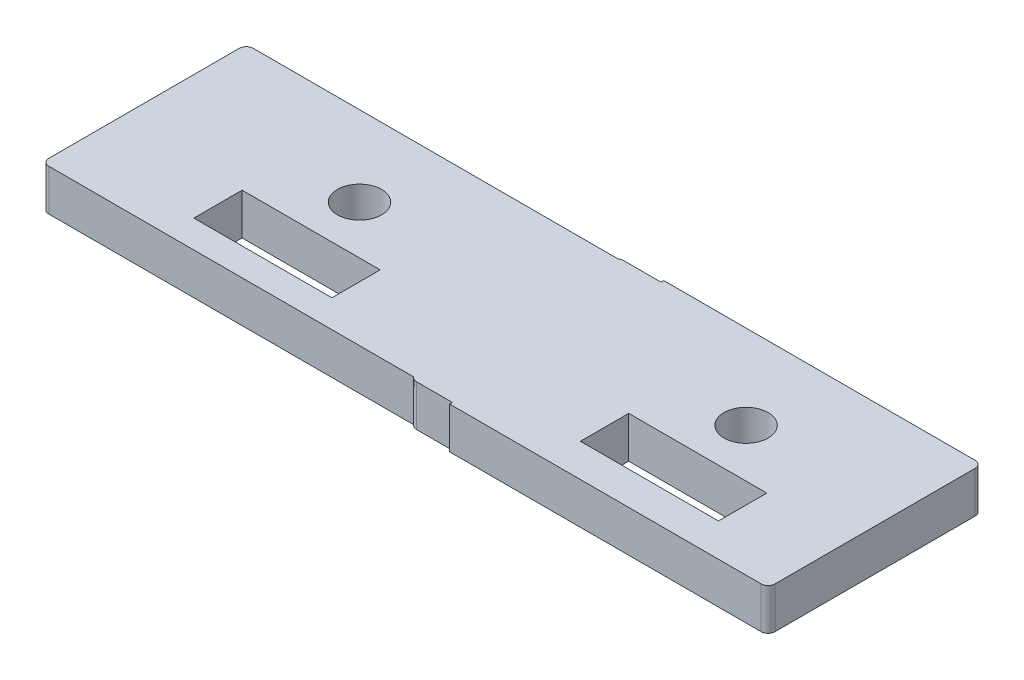
ISO-10303-21;
HEADER;
FILE_DESCRIPTION(('STEP AP214'),'2;1');
FILE_NAME('part.step','',(''),(''),'','','');
FILE_SCHEMA(('AUTOMOTIVE_DESIGN { 1 0 10303 214 1 1 1 1 }'));
ENDSEC;
DATA;
#1=APPLICATION_CONTEXT('core data for automotive mechanical design processes');
#2=APPLICATION_PROTOCOL_DEFINITION('international standard','automotive_design',2000,#1);
#3=PRODUCT_CONTEXT('',#1,'mechanical');
#4=PRODUCT('Part','Part','',(#3));
#5=PRODUCT_RELATED_PRODUCT_CATEGORY('part','',(#4));
#6=PRODUCT_DEFINITION_FORMATION('','',#4);
#7=PRODUCT_DEFINITION_CONTEXT('part definition',#1,'design');
#8=PRODUCT_DEFINITION('design','',#6,#7);
#9=PRODUCT_DEFINITION_SHAPE('','',#8);
#10=(LENGTH_UNIT() NAMED_UNIT(*) SI_UNIT(.MILLI.,.METRE.));
#11=(NAMED_UNIT(*) PLANE_ANGLE_UNIT() SI_UNIT($,.RADIAN.));
#12=(NAMED_UNIT(*) SI_UNIT($,.STERADIAN.) SOLID_ANGLE_UNIT());
#13=UNCERTAINTY_MEASURE_WITH_UNIT(LENGTH_MEASURE(1.E-05),#10,'distance_accuracy_value','');
#14=(GEOMETRIC_REPRESENTATION_CONTEXT(3) GLOBAL_UNCERTAINTY_ASSIGNED_CONTEXT((#13)) GLOBAL_UNIT_ASSIGNED_CONTEXT((#10,
#11,#12)) REPRESENTATION_CONTEXT('',''));
#15=CARTESIAN_POINT('',(0.,0.,0.));
#16=DIRECTION('',(0.,0.,1.));
#17=DIRECTION('',(1.,0.,0.));
#18=AXIS2_PLACEMENT_3D('',#15,#16,#17);
#19=CARTESIAN_POINT('',(0.,10.,0.100000000000835));
#20=DIRECTION('',(0.,0.,1.));
#21=DIRECTION('',(1.,0.,0.));
#22=AXIS2_PLACEMENT_3D('',#19,#20,#21);
#23=PLANE('',#22);
#24=DIRECTION('',(-1.,0.,0.));
#25=VECTOR('',#24,1.);
#26=CARTESIAN_POINT('',(0.,0.,0.100000000000835));
#27=LINE('',#26,#25);
#28=CARTESIAN_POINT('',(-45.0678313095659,0.,0.10000000000083));
#29=VERTEX_POINT('',#28);
#30=CARTESIAN_POINT('',(-47.7678313095659,0.,0.10000000000083));
#31=VERTEX_POINT('',#30);
#32=EDGE_CURVE('E279',#29,#31,#27,.T.);
#33=ORIENTED_EDGE('',*,*,#32,.T.);
#34=DIRECTION('',(0.,-1.,0.));
#35=VECTOR('',#34,1.);
#36=CARTESIAN_POINT('',(-47.7678313095659,10.,0.10000000000083));
#37=LINE('',#36,#35);
#38=CARTESIAN_POINT('',(-47.7678313095659,3.,0.10000000000083));
#39=VERTEX_POINT('',#38);
#40=EDGE_CURVE('E432',#31,#39,#37,.F.);
#41=ORIENTED_EDGE('',*,*,#40,.T.);
#42=DIRECTION('',(-1.,0.,0.));
#43=VECTOR('',#42,1.);
#44=CARTESIAN_POINT('',(0.,3.,0.100000000000835));
#45=LINE('',#44,#43);
#46=CARTESIAN_POINT('',(-45.0678313095659,3.,0.10000000000083));
#47=VERTEX_POINT('',#46);
#48=EDGE_CURVE('E294',#47,#39,#45,.T.);
#49=ORIENTED_EDGE('',*,*,#48,.F.);
#50=DIRECTION('',(0.,1.,0.));
#51=VECTOR('',#50,1.);
#52=CARTESIAN_POINT('',(-45.0678313095659,0.,0.10000000000083));
#53=LINE('',#52,#51);
#54=EDGE_CURVE('E235',#29,#47,#53,.T.);
#55=ORIENTED_EDGE('',*,*,#54,.F.);
#56=EDGE_LOOP('',(#33,#41,#49,#55));
#57=FACE_BOUND('',#56,.T.);
#58=ADVANCED_FACE('F42',(#57),#23,.F.);
#59=CARTESIAN_POINT('',(-75.,3.,15.));
#60=DIRECTION('',(0.,0.,-1.));
#61=DIRECTION('',(-1.,0.,0.));
#62=AXIS2_PLACEMENT_3D('',#59,#60,#61);
#63=PLANE('',#62);
#64=DIRECTION('',(1.,0.,0.));
#65=VECTOR('',#64,1.);
#66=CARTESIAN_POINT('',(-75.,3.,15.));
#67=LINE('',#66,#65);
#68=CARTESIAN_POINT('',(-74.5,3.,15.));
#69=VERTEX_POINT('',#68);
#70=CARTESIAN_POINT('',(-48.0678313095659,3.,15.));
#71=VERTEX_POINT('',#70);
#72=EDGE_CURVE('E405',#69,#71,#67,.T.);
#73=ORIENTED_EDGE('',*,*,#72,.F.);
#74=DIRECTION('',(0.,-1.,0.));
#75=VECTOR('',#74,1.);
#76=CARTESIAN_POINT('',(-74.5,3.,15.));
#77=LINE('',#76,#75);
#78=CARTESIAN_POINT('',(-74.5,0.,15.));
#79=VERTEX_POINT('',#78);
#80=EDGE_CURVE('E11',#69,#79,#77,.T.);
#81=ORIENTED_EDGE('',*,*,#80,.T.);
#82=DIRECTION('',(1.,0.,0.));
#83=VECTOR('',#82,1.);
#84=CARTESIAN_POINT('',(-75.,0.,15.));
#85=LINE('',#84,#83);
#86=CARTESIAN_POINT('',(-48.0678313095659,0.,15.));
#87=VERTEX_POINT('',#86);
#88=EDGE_CURVE('E406',#79,#87,#85,.T.);
#89=ORIENTED_EDGE('',*,*,#88,.T.);
#90=DIRECTION('',(0.,-1.,0.));
#91=VECTOR('',#90,1.);
#92=CARTESIAN_POINT('',(-48.0678313095659,3.,15.));
#93=LINE('',#92,#91);
#94=EDGE_CURVE('E262',#71,#87,#93,.T.);
#95=ORIENTED_EDGE('',*,*,#94,.F.);
#96=EDGE_LOOP('',(#73,#81,#89,#95));
#97=FACE_BOUND('',#96,.T.);
#98=ADVANCED_FACE('F495',(#97),#63,.F.);
#99=CARTESIAN_POINT('',(-75.,3.,15.));
#100=DIRECTION('',(1.,0.,0.));
#101=DIRECTION('',(0.,0.,-1.));
#102=AXIS2_PLACEMENT_3D('',#99,#100,#101);
#103=PLANE('',#102);
#104=DIRECTION('',(0.,0.,1.));
#105=VECTOR('',#104,1.);
#106=CARTESIAN_POINT('',(-75.,3.,15.));
#107=LINE('',#106,#105);
#108=CARTESIAN_POINT('',(-75.,3.,0.700000000000827));
#109=VERTEX_POINT('',#108);
#110=CARTESIAN_POINT('',(-75.,3.,14.5));
#111=VERTEX_POINT('',#110);
#112=EDGE_CURVE('E402',#109,#111,#107,.T.);
#113=ORIENTED_EDGE('',*,*,#112,.F.);
#114=DIRECTION('',(0.,-1.,0.));
#115=VECTOR('',#114,1.);
#116=CARTESIAN_POINT('',(-75.,3.,0.700000000000827));
#117=LINE('',#116,#115);
#118=CARTESIAN_POINT('',(-75.,0.,0.700000000000827));
#119=VERTEX_POINT('',#118);
#120=EDGE_CURVE('E470',#109,#119,#117,.T.);
#121=ORIENTED_EDGE('',*,*,#120,.T.);
#122=DIRECTION('',(0.,0.,1.));
#123=VECTOR('',#122,1.);
#124=CARTESIAN_POINT('',(-75.,0.,15.));
#125=LINE('',#124,#123);
#126=CARTESIAN_POINT('',(-75.,0.,14.5));
#127=VERTEX_POINT('',#126);
#128=EDGE_CURVE('E392',#119,#127,#125,.T.);
#129=ORIENTED_EDGE('',*,*,#128,.T.);
#130=DIRECTION('',(0.,-1.,0.));
#131=VECTOR('',#130,1.);
#132=CARTESIAN_POINT('',(-75.,3.,14.5));
#133=LINE('',#132,#131);
#134=EDGE_CURVE('E58',#127,#111,#133,.F.);
#135=ORIENTED_EDGE('',*,*,#134,.T.);
#136=EDGE_LOOP('',(#113,#121,#129,#135));
#137=FACE_BOUND('',#136,.T.);
#138=ADVANCED_FACE('F485',(#137),#103,.F.);
#139=CARTESIAN_POINT('',(0.,3.,0.));
#140=DIRECTION('',(0.,-1.,0.));
#141=DIRECTION('',(0.,0.,-1.));
#142=AXIS2_PLACEMENT_3D('',#139,#140,#141);
#143=PLANE('',#142);
#144=DIRECTION('',(1.,0.,0.));
#145=VECTOR('',#144,1.);
#146=CARTESIAN_POINT('',(-66.,3.,13.0000000000008));
#147=LINE('',#146,#145);
#148=CARTESIAN_POINT('',(-66.,3.,13.0000000000008));
#149=VERTEX_POINT('',#148);
#150=CARTESIAN_POINT('',(-56.,3.,13.0000000000008));
#151=VERTEX_POINT('',#150);
#152=EDGE_CURVE('E378',#149,#151,#147,.T.);
#153=ORIENTED_EDGE('',*,*,#152,.F.);
#154=DIRECTION('',(0.,0.,1.));
#155=VECTOR('',#154,1.);
#156=CARTESIAN_POINT('',(-66.,3.,9.50000000000086));
#157=LINE('',#156,#155);
#158=CARTESIAN_POINT('',(-66.,3.,9.50000000000086));
#159=VERTEX_POINT('',#158);
#160=EDGE_CURVE('E302',#159,#149,#157,.T.);
#161=ORIENTED_EDGE('',*,*,#160,.F.);
#162=DIRECTION('',(-1.,0.,0.));
#163=VECTOR('',#162,1.);
#164=CARTESIAN_POINT('',(-66.,3.,9.50000000000086));
#165=LINE('',#164,#163);
#166=CARTESIAN_POINT('',(-56.,3.,9.50000000000086));
#167=VERTEX_POINT('',#166);
#168=EDGE_CURVE('E363',#167,#159,#165,.T.);
#169=ORIENTED_EDGE('',*,*,#168,.F.);
#170=DIRECTION('',(0.,0.,-1.));
#171=VECTOR('',#170,1.);
#172=CARTESIAN_POINT('',(-56.,3.,9.50000000000086));
#173=LINE('',#172,#171);
#174=EDGE_CURVE('E382',#151,#167,#173,.T.);
#175=ORIENTED_EDGE('',*,*,#174,.F.);
#176=EDGE_LOOP('',(#153,#161,#169,#175));
#177=FACE_BOUND('',#176,.T.);
#178=CARTESIAN_POINT('',(-33.,3.,6.00000000000105));
#179=DIRECTION('',(0.,1.,0.));
#180=DIRECTION('',(0.,0.,-1.));
#181=AXIS2_PLACEMENT_3D('',#178,#179,#180);
#182=CIRCLE('',#181,1.60000000000001);
#183=CARTESIAN_POINT('',(-33.,3.,4.40000000000104));
#184=VERTEX_POINT('',#183);
#185=EDGE_CURVE('E303',#184,#184,#182,.T.);
#186=ORIENTED_EDGE('',*,*,#185,.F.);
#187=EDGE_LOOP('',(#186));
#188=FACE_BOUND('',#187,.T.);
#189=DIRECTION('',(1.,0.,0.));
#190=VECTOR('',#189,1.);
#191=CARTESIAN_POINT('',(-38.,3.,13.0000000000011));
#192=LINE('',#191,#190);
#193=CARTESIAN_POINT('',(-38.,3.,13.0000000000011));
#194=VERTEX_POINT('',#193);
#195=CARTESIAN_POINT('',(-28.,3.,13.0000000000011));
#196=VERTEX_POINT('',#195);
#197=EDGE_CURVE('E329',#194,#196,#192,.T.);
#198=ORIENTED_EDGE('',*,*,#197,.F.);
#199=DIRECTION('',(0.,0.,1.));
#200=VECTOR('',#199,1.);
#201=CARTESIAN_POINT('',(-38.,3.,9.50000000000106));
#202=LINE('',#201,#200);
#203=CARTESIAN_POINT('',(-38.,3.,9.50000000000106));
#204=VERTEX_POINT('',#203);
#205=EDGE_CURVE('E326',#204,#194,#202,.T.);
#206=ORIENTED_EDGE('',*,*,#205,.F.);
#207=DIRECTION('',(-1.,0.,0.));
#208=VECTOR('',#207,1.);
#209=CARTESIAN_POINT('',(-38.,3.,9.50000000000106));
#210=LINE('',#209,#208);
#211=CARTESIAN_POINT('',(-28.,3.,9.50000000000106));
#212=VERTEX_POINT('',#211);
#213=EDGE_CURVE('E313',#212,#204,#210,.T.);
#214=ORIENTED_EDGE('',*,*,#213,.F.);
#215=DIRECTION('',(0.,0.,-1.));
#216=VECTOR('',#215,1.);
#217=CARTESIAN_POINT('',(-28.,3.,9.50000000000106));
#218=LINE('',#217,#216);
#219=EDGE_CURVE('E334',#196,#212,#218,.T.);
#220=ORIENTED_EDGE('',*,*,#219,.F.);
#221=EDGE_LOOP('',(#198,#206,#214,#220));
#222=FACE_BOUND('',#221,.T.);
#223=CARTESIAN_POINT('',(-61.,3.,6.00000000000085));
#224=DIRECTION('',(0.,1.,0.));
#225=DIRECTION('',(0.,0.,-1.));
#226=AXIS2_PLACEMENT_3D('',#223,#224,#225);
#227=CIRCLE('',#226,1.60000000000001);
#228=CARTESIAN_POINT('',(-61.,3.,4.40000000000085));
#229=VERTEX_POINT('',#228);
#230=EDGE_CURVE('E297',#229,#229,#227,.T.);
#231=ORIENTED_EDGE('',*,*,#230,.F.);
#232=EDGE_LOOP('',(#231));
#233=FACE_BOUND('',#232,.T.);
#234=ORIENTED_EDGE('',*,*,#48,.T.);
#235=CARTESIAN_POINT('',(-47.7678313095659,3.,0.60000000000083));
#236=DIRECTION('',(0.,-1.,0.));
#237=DIRECTION('',(0.,0.,-1.));
#238=AXIS2_PLACEMENT_3D('',#235,#236,#237);
#239=CIRCLE('',#238,0.5);
#240=CARTESIAN_POINT('',(-48.0678313095659,3.,0.200000000000829));
#241=VERTEX_POINT('',#240);
#242=EDGE_CURVE('E449',#39,#241,#239,.F.);
#243=ORIENTED_EDGE('',*,*,#242,.T.);
#244=DIRECTION('',(-1.,0.,0.));
#245=VECTOR('',#244,1.);
#246=CARTESIAN_POINT('',(0.,3.,0.200000000000835));
#247=LINE('',#246,#245);
#248=CARTESIAN_POINT('',(-74.5,3.,0.200000000000826));
#249=VERTEX_POINT('',#248);
#250=EDGE_CURVE('E287',#241,#249,#247,.T.);
#251=ORIENTED_EDGE('',*,*,#250,.T.);
#252=CARTESIAN_POINT('',(-74.5,3.,0.700000000000827));
#253=DIRECTION('',(0.,-1.,0.));
#254=DIRECTION('',(0.,0.,-1.));
#255=AXIS2_PLACEMENT_3D('',#252,#253,#254);
#256=CIRCLE('',#255,0.5);
#257=EDGE_CURVE('E65',#249,#109,#256,.F.);
#258=ORIENTED_EDGE('',*,*,#257,.T.);
#259=ORIENTED_EDGE('',*,*,#112,.T.);
#260=CARTESIAN_POINT('',(-74.5,3.,14.5));
#261=DIRECTION('',(0.,-1.,0.));
#262=DIRECTION('',(0.,0.,-1.));
#263=AXIS2_PLACEMENT_3D('',#260,#261,#262);
#264=CIRCLE('',#263,0.5);
#265=EDGE_CURVE('E435',#111,#69,#264,.F.);
#266=ORIENTED_EDGE('',*,*,#265,.T.);
#267=ORIENTED_EDGE('',*,*,#72,.T.);
#268=CARTESIAN_POINT('',(-47.6678313095659,3.,14.7));
#269=DIRECTION('',(0.,-1.,0.));
#270=DIRECTION('',(0.,0.,-1.));
#271=AXIS2_PLACEMENT_3D('',#268,#269,#270);
#272=CIRCLE('',#271,0.5);
#273=CARTESIAN_POINT('',(-47.6678313095659,3.,15.2));
#274=VERTEX_POINT('',#273);
#275=EDGE_CURVE('E446',#71,#274,#272,.F.);
#276=ORIENTED_EDGE('',*,*,#275,.T.);
#277=DIRECTION('',(-1.,0.,0.));
#278=VECTOR('',#277,1.);
#279=CARTESIAN_POINT('',(-48.0678313095659,3.,15.2));
#280=LINE('',#279,#278);
#281=CARTESIAN_POINT('',(-45.0678313095659,3.,15.2));
#282=VERTEX_POINT('',#281);
#283=EDGE_CURVE('E233',#282,#274,#280,.T.);
#284=ORIENTED_EDGE('',*,*,#283,.F.);
#285=DIRECTION('',(0.,0.,-1.));
#286=VECTOR('',#285,1.);
#287=CARTESIAN_POINT('',(-45.0678313095659,3.,15.4));
#288=LINE('',#287,#286);
#289=CARTESIAN_POINT('',(-45.0678313095659,3.,15.4));
#290=VERTEX_POINT('',#289);
#291=EDGE_CURVE('E222',#290,#282,#288,.T.);
#292=ORIENTED_EDGE('',*,*,#291,.F.);
#293=DIRECTION('',(-1.,0.,0.));
#294=VECTOR('',#293,1.);
#295=CARTESIAN_POINT('',(0.,3.,15.4));
#296=LINE('',#295,#294);
#297=CARTESIAN_POINT('',(-22.5080123362056,3.,15.4));
#298=VERTEX_POINT('',#297);
#299=EDGE_CURVE('E206',#298,#290,#296,.T.);
#300=ORIENTED_EDGE('',*,*,#299,.F.);
#301=CARTESIAN_POINT('',(-22.5080123362056,3.,14.9));
#302=DIRECTION('',(0.,-1.,0.));
#303=DIRECTION('',(0.,0.,-1.));
#304=AXIS2_PLACEMENT_3D('',#301,#302,#303);
#305=CIRCLE('',#304,0.5);
#306=CARTESIAN_POINT('',(-22.0080123362056,3.,14.9));
#307=VERTEX_POINT('',#306);
#308=EDGE_CURVE('E443',#298,#307,#305,.F.);
#309=ORIENTED_EDGE('',*,*,#308,.T.);
#310=DIRECTION('',(0.,0.,-1.));
#311=VECTOR('',#310,1.);
#312=CARTESIAN_POINT('',(-22.0080123362056,3.,0.));
#313=LINE('',#312,#311);
#314=CARTESIAN_POINT('',(-22.0080123362056,3.,0.400000000000833));
#315=VERTEX_POINT('',#314);
#316=EDGE_CURVE('E290',#307,#315,#313,.T.);
#317=ORIENTED_EDGE('',*,*,#316,.T.);
#318=CARTESIAN_POINT('',(-22.5080123362056,3.,0.400000000000833));
#319=DIRECTION('',(0.,-1.,0.));
#320=DIRECTION('',(0.,0.,-1.));
#321=AXIS2_PLACEMENT_3D('',#318,#319,#320);
#322=CIRCLE('',#321,0.5);
#323=CARTESIAN_POINT('',(-22.5080123362056,3.,-0.0999999999991671));
#324=VERTEX_POINT('',#323);
#325=EDGE_CURVE('E440',#315,#324,#322,.F.);
#326=ORIENTED_EDGE('',*,*,#325,.T.);
#327=DIRECTION('',(1.,0.,0.));
#328=VECTOR('',#327,1.);
#329=CARTESIAN_POINT('',(0.,3.,-0.0999999999991645));
#330=LINE('',#329,#328);
#331=CARTESIAN_POINT('',(-45.0678313095659,3.,-0.0999999999991698));
#332=VERTEX_POINT('',#331);
#333=EDGE_CURVE('E250',#332,#324,#330,.T.);
#334=ORIENTED_EDGE('',*,*,#333,.F.);
#335=DIRECTION('',(0.,0.,1.));
#336=VECTOR('',#335,1.);
#337=CARTESIAN_POINT('',(-45.0678313095659,3.,-0.0999999999991698));
#338=LINE('',#337,#336);
#339=EDGE_CURVE('E253',#332,#47,#338,.T.);
#340=ORIENTED_EDGE('',*,*,#339,.T.);
#341=EDGE_LOOP('',(#234,#243,#251,#258,#259,#266,#267,#276,#284,#292,#300,#309,#317,#326,#334,#340));
#342=FACE_BOUND('',#341,.T.);
#343=ADVANCED_FACE('F231',(#177,#188,#222,#233,#342),#143,.F.);
#344=CARTESIAN_POINT('',(0.,0.,0.));
#345=DIRECTION('',(0.,-1.,0.));
#346=DIRECTION('',(0.,0.,-1.));
#347=AXIS2_PLACEMENT_3D('',#344,#345,#346);
#348=PLANE('',#347);
#349=DIRECTION('',(-1.,0.,0.));
#350=VECTOR('',#349,1.);
#351=CARTESIAN_POINT('',(0.,0.,0.200000000000835));
#352=LINE('',#351,#350);
#353=CARTESIAN_POINT('',(-48.0678313095659,0.,0.200000000000829));
#354=VERTEX_POINT('',#353);
#355=CARTESIAN_POINT('',(-74.5,0.,0.200000000000826));
#356=VERTEX_POINT('',#355);
#357=EDGE_CURVE('E268',#354,#356,#352,.T.);
#358=ORIENTED_EDGE('',*,*,#357,.F.);
#359=CARTESIAN_POINT('',(-47.7678313095659,0.,0.60000000000083));
#360=DIRECTION('',(0.,-1.,0.));
#361=DIRECTION('',(0.,0.,-1.));
#362=AXIS2_PLACEMENT_3D('',#359,#360,#361);
#363=CIRCLE('',#362,0.5);
#364=EDGE_CURVE('E429',#354,#31,#363,.T.);
#365=ORIENTED_EDGE('',*,*,#364,.T.);
#366=ORIENTED_EDGE('',*,*,#32,.F.);
#367=DIRECTION('',(0.,0.,1.));
#368=VECTOR('',#367,1.);
#369=CARTESIAN_POINT('',(-45.0678313095659,0.,-0.0999999999991698));
#370=LINE('',#369,#368);
#371=CARTESIAN_POINT('',(-45.0678313095659,0.,-0.0999999999991698));
#372=VERTEX_POINT('',#371);
#373=EDGE_CURVE('E258',#372,#29,#370,.T.);
#374=ORIENTED_EDGE('',*,*,#373,.F.);
#375=DIRECTION('',(-1.,0.,0.));
#376=VECTOR('',#375,1.);
#377=CARTESIAN_POINT('',(0.,0.,-0.0999999999991645));
#378=LINE('',#377,#376);
#379=CARTESIAN_POINT('',(-22.5080123362056,0.,-0.0999999999991671));
#380=VERTEX_POINT('',#379);
#381=EDGE_CURVE('E240',#380,#372,#378,.T.);
#382=ORIENTED_EDGE('',*,*,#381,.F.);
#383=CARTESIAN_POINT('',(-22.5080123362056,0.,0.400000000000833));
#384=DIRECTION('',(0.,-1.,0.));
#385=DIRECTION('',(0.,0.,-1.));
#386=AXIS2_PLACEMENT_3D('',#383,#384,#385);
#387=CIRCLE('',#386,0.5);
#388=CARTESIAN_POINT('',(-22.0080123362056,0.,0.400000000000833));
#389=VERTEX_POINT('',#388);
#390=EDGE_CURVE('E420',#380,#389,#387,.T.);
#391=ORIENTED_EDGE('',*,*,#390,.T.);
#392=DIRECTION('',(0.,0.,-1.));
#393=VECTOR('',#392,1.);
#394=CARTESIAN_POINT('',(-22.0080123362056,0.,0.));
#395=LINE('',#394,#393);
#396=CARTESIAN_POINT('',(-22.0080123362056,0.,14.9));
#397=VERTEX_POINT('',#396);
#398=EDGE_CURVE('E275',#397,#389,#395,.T.);
#399=ORIENTED_EDGE('',*,*,#398,.F.);
#400=CARTESIAN_POINT('',(-22.5080123362056,0.,14.9));
#401=DIRECTION('',(0.,-1.,0.));
#402=DIRECTION('',(0.,0.,-1.));
#403=AXIS2_PLACEMENT_3D('',#400,#401,#402);
#404=CIRCLE('',#403,0.5);
#405=CARTESIAN_POINT('',(-22.5080123362056,0.,15.4));
#406=VERTEX_POINT('',#405);
#407=EDGE_CURVE('E423',#397,#406,#404,.T.);
#408=ORIENTED_EDGE('',*,*,#407,.T.);
#409=DIRECTION('',(1.,0.,0.));
#410=VECTOR('',#409,1.);
#411=CARTESIAN_POINT('',(0.,0.,15.4));
#412=LINE('',#411,#410);
#413=CARTESIAN_POINT('',(-45.0678313095659,0.,15.4));
#414=VERTEX_POINT('',#413);
#415=EDGE_CURVE('E227',#414,#406,#412,.T.);
#416=ORIENTED_EDGE('',*,*,#415,.F.);
#417=DIRECTION('',(0.,0.,-1.));
#418=VECTOR('',#417,1.);
#419=CARTESIAN_POINT('',(-45.0678313095659,0.,15.4));
#420=LINE('',#419,#418);
#421=CARTESIAN_POINT('',(-45.0678313095659,0.,15.2));
#422=VERTEX_POINT('',#421);
#423=EDGE_CURVE('E224',#414,#422,#420,.T.);
#424=ORIENTED_EDGE('',*,*,#423,.T.);
#425=DIRECTION('',(1.,0.,0.));
#426=VECTOR('',#425,1.);
#427=CARTESIAN_POINT('',(-48.0678313095659,0.,15.2));
#428=LINE('',#427,#426);
#429=CARTESIAN_POINT('',(-47.6678313095659,0.,15.2));
#430=VERTEX_POINT('',#429);
#431=EDGE_CURVE('E263',#430,#422,#428,.T.);
#432=ORIENTED_EDGE('',*,*,#431,.F.);
#433=CARTESIAN_POINT('',(-47.6678313095659,0.,14.7));
#434=DIRECTION('',(0.,-1.,0.));
#435=DIRECTION('',(0.,0.,-1.));
#436=AXIS2_PLACEMENT_3D('',#433,#434,#435);
#437=CIRCLE('',#436,0.5);
#438=EDGE_CURVE('E426',#430,#87,#437,.T.);
#439=ORIENTED_EDGE('',*,*,#438,.T.);
#440=ORIENTED_EDGE('',*,*,#88,.F.);
#441=CARTESIAN_POINT('',(-74.5,0.,14.5));
#442=DIRECTION('',(0.,-1.,0.));
#443=DIRECTION('',(0.,0.,-1.));
#444=AXIS2_PLACEMENT_3D('',#441,#442,#443);
#445=CIRCLE('',#444,0.5);
#446=EDGE_CURVE('E409',#79,#127,#445,.T.);
#447=ORIENTED_EDGE('',*,*,#446,.T.);
#448=ORIENTED_EDGE('',*,*,#128,.F.);
#449=CARTESIAN_POINT('',(-74.5,0.,0.700000000000827));
#450=DIRECTION('',(0.,-1.,0.));
#451=DIRECTION('',(0.,0.,-1.));
#452=AXIS2_PLACEMENT_3D('',#449,#450,#451);
#453=CIRCLE('',#452,0.5);
#454=EDGE_CURVE('E417',#119,#356,#453,.T.);
#455=ORIENTED_EDGE('',*,*,#454,.T.);
#456=EDGE_LOOP('',(#358,#365,#366,#374,#382,#391,#399,#408,#416,#424,#432,#439,#440,#447,#448,#455));
#457=FACE_BOUND('',#456,.T.);
#458=DIRECTION('',(0.,0.,1.));
#459=VECTOR('',#458,1.);
#460=CARTESIAN_POINT('',(-66.,0.,9.50000000000086));
#461=LINE('',#460,#459);
#462=CARTESIAN_POINT('',(-66.,0.,9.50000000000086));
#463=VERTEX_POINT('',#462);
#464=CARTESIAN_POINT('',(-66.,0.,13.0000000000008));
#465=VERTEX_POINT('',#464);
#466=EDGE_CURVE('E358',#463,#465,#461,.T.);
#467=ORIENTED_EDGE('',*,*,#466,.T.);
#468=DIRECTION('',(1.,0.,0.));
#469=VECTOR('',#468,1.);
#470=CARTESIAN_POINT('',(-66.,0.,13.0000000000008));
#471=LINE('',#470,#469);
#472=CARTESIAN_POINT('',(-56.,0.,13.0000000000008));
#473=VERTEX_POINT('',#472);
#474=EDGE_CURVE('E362',#465,#473,#471,.T.);
#475=ORIENTED_EDGE('',*,*,#474,.T.);
#476=DIRECTION('',(0.,0.,-1.));
#477=VECTOR('',#476,1.);
#478=CARTESIAN_POINT('',(-56.,0.,9.50000000000086));
#479=LINE('',#478,#477);
#480=CARTESIAN_POINT('',(-56.,0.,9.50000000000086));
#481=VERTEX_POINT('',#480);
#482=EDGE_CURVE('E367',#473,#481,#479,.T.);
#483=ORIENTED_EDGE('',*,*,#482,.T.);
#484=DIRECTION('',(-1.,0.,0.));
#485=VECTOR('',#484,1.);
#486=CARTESIAN_POINT('',(-66.,0.,9.50000000000086));
#487=LINE('',#486,#485);
#488=EDGE_CURVE('E371',#481,#463,#487,.T.);
#489=ORIENTED_EDGE('',*,*,#488,.T.);
#490=EDGE_LOOP('',(#467,#475,#483,#489));
#491=FACE_BOUND('',#490,.T.);
#492=CARTESIAN_POINT('',(-33.,0.,6.00000000000105));
#493=DIRECTION('',(0.,1.,0.));
#494=DIRECTION('',(0.,0.,-1.));
#495=AXIS2_PLACEMENT_3D('',#492,#493,#494);
#496=CIRCLE('',#495,1.60000000000001);
#497=CARTESIAN_POINT('',(-33.,0.,4.40000000000104));
#498=VERTEX_POINT('',#497);
#499=EDGE_CURVE('E298',#498,#498,#496,.T.);
#500=ORIENTED_EDGE('',*,*,#499,.T.);
#501=EDGE_LOOP('',(#500));
#502=FACE_BOUND('',#501,.T.);
#503=DIRECTION('',(0.,0.,1.));
#504=VECTOR('',#503,1.);
#505=CARTESIAN_POINT('',(-38.,0.,9.50000000000106));
#506=LINE('',#505,#504);
#507=CARTESIAN_POINT('',(-38.,0.,9.50000000000106));
#508=VERTEX_POINT('',#507);
#509=CARTESIAN_POINT('',(-38.,0.,13.0000000000011));
#510=VERTEX_POINT('',#509);
#511=EDGE_CURVE('E308',#508,#510,#506,.T.);
#512=ORIENTED_EDGE('',*,*,#511,.T.);
#513=DIRECTION('',(1.,0.,0.));
#514=VECTOR('',#513,1.);
#515=CARTESIAN_POINT('',(-38.,0.,13.0000000000011));
#516=LINE('',#515,#514);
#517=CARTESIAN_POINT('',(-28.,0.,13.0000000000011));
#518=VERTEX_POINT('',#517);
#519=EDGE_CURVE('E312',#510,#518,#516,.T.);
#520=ORIENTED_EDGE('',*,*,#519,.T.);
#521=DIRECTION('',(0.,0.,-1.));
#522=VECTOR('',#521,1.);
#523=CARTESIAN_POINT('',(-28.,0.,9.50000000000106));
#524=LINE('',#523,#522);
#525=CARTESIAN_POINT('',(-28.,0.,9.50000000000106));
#526=VERTEX_POINT('',#525);
#527=EDGE_CURVE('E317',#518,#526,#524,.T.);
#528=ORIENTED_EDGE('',*,*,#527,.T.);
#529=DIRECTION('',(-1.,0.,0.));
#530=VECTOR('',#529,1.);
#531=CARTESIAN_POINT('',(-38.,0.,9.50000000000106));
#532=LINE('',#531,#530);
#533=EDGE_CURVE('E321',#526,#508,#532,.T.);
#534=ORIENTED_EDGE('',*,*,#533,.T.);
#535=EDGE_LOOP('',(#512,#520,#528,#534));
#536=FACE_BOUND('',#535,.T.);
#537=CARTESIAN_POINT('',(-61.,0.,6.00000000000085));
#538=DIRECTION('',(0.,1.,0.));
#539=DIRECTION('',(0.,0.,-1.));
#540=AXIS2_PLACEMENT_3D('',#537,#538,#539);
#541=CIRCLE('',#540,1.60000000000001);
#542=CARTESIAN_POINT('',(-61.,0.,4.40000000000085));
#543=VERTEX_POINT('',#542);
#544=EDGE_CURVE('E330',#543,#543,#541,.T.);
#545=ORIENTED_EDGE('',*,*,#544,.T.);
#546=EDGE_LOOP('',(#545));
#547=FACE_BOUND('',#546,.T.);
#548=ADVANCED_FACE('F487',(#457,#491,#502,#536,#547),#348,.T.);
#549=CARTESIAN_POINT('',(-61.,0.,6.00000000000085));
#550=DIRECTION('',(0.,1.,0.));
#551=DIRECTION('',(0.,0.,1.));
#552=AXIS2_PLACEMENT_3D('',#549,#550,#551);
#553=CYLINDRICAL_SURFACE('',#552,1.60000000000001);
#554=ORIENTED_EDGE('',*,*,#544,.F.);
#555=EDGE_LOOP('',(#554));
#556=FACE_BOUND('',#555,.T.);
#557=ORIENTED_EDGE('',*,*,#230,.T.);
#558=EDGE_LOOP('',(#557));
#559=FACE_BOUND('',#558,.T.);
#560=ADVANCED_FACE('F567',(#556,#559),#553,.F.);
#561=CARTESIAN_POINT('',(-38.,0.,9.50000000000106));
#562=DIRECTION('',(-1.,0.,0.));
#563=DIRECTION('',(0.,0.,1.));
#564=AXIS2_PLACEMENT_3D('',#561,#562,#563);
#565=PLANE('',#564);
#566=ORIENTED_EDGE('',*,*,#205,.T.);
#567=DIRECTION('',(0.,1.,0.));
#568=VECTOR('',#567,1.);
#569=CARTESIAN_POINT('',(-38.,0.,13.0000000000011));
#570=LINE('',#569,#568);
#571=EDGE_CURVE('E325',#510,#194,#570,.T.);
#572=ORIENTED_EDGE('',*,*,#571,.F.);
#573=ORIENTED_EDGE('',*,*,#511,.F.);
#574=DIRECTION('',(0.,1.,0.));
#575=VECTOR('',#574,1.);
#576=CARTESIAN_POINT('',(-38.,0.,9.50000000000106));
#577=LINE('',#576,#575);
#578=EDGE_CURVE('E307',#508,#204,#577,.T.);
#579=ORIENTED_EDGE('',*,*,#578,.T.);
#580=EDGE_LOOP('',(#566,#572,#573,#579));
#581=FACE_BOUND('',#580,.T.);
#582=ADVANCED_FACE('F557',(#581),#565,.F.);
#583=CARTESIAN_POINT('',(-38.,0.,9.50000000000106));
#584=DIRECTION('',(0.,0.,-1.));
#585=DIRECTION('',(-1.,0.,0.));
#586=AXIS2_PLACEMENT_3D('',#583,#584,#585);
#587=PLANE('',#586);
#588=ORIENTED_EDGE('',*,*,#213,.T.);
#589=ORIENTED_EDGE('',*,*,#578,.F.);
#590=ORIENTED_EDGE('',*,*,#533,.F.);
#591=DIRECTION('',(0.,1.,0.));
#592=VECTOR('',#591,1.);
#593=CARTESIAN_POINT('',(-28.,0.,9.50000000000106));
#594=LINE('',#593,#592);
#595=EDGE_CURVE('E343',#526,#212,#594,.T.);
#596=ORIENTED_EDGE('',*,*,#595,.T.);
#597=EDGE_LOOP('',(#588,#589,#590,#596));
#598=FACE_BOUND('',#597,.T.);
#599=ADVANCED_FACE('F553',(#598),#587,.F.);
#600=CARTESIAN_POINT('',(-28.,0.,9.50000000000106));
#601=DIRECTION('',(1.,0.,0.));
#602=DIRECTION('',(0.,0.,-1.));
#603=AXIS2_PLACEMENT_3D('',#600,#601,#602);
#604=PLANE('',#603);
#605=ORIENTED_EDGE('',*,*,#219,.T.);
#606=ORIENTED_EDGE('',*,*,#595,.F.);
#607=ORIENTED_EDGE('',*,*,#527,.F.);
#608=DIRECTION('',(0.,1.,0.));
#609=VECTOR('',#608,1.);
#610=CARTESIAN_POINT('',(-28.,0.,13.0000000000011));
#611=LINE('',#610,#609);
#612=EDGE_CURVE('E346',#518,#196,#611,.T.);
#613=ORIENTED_EDGE('',*,*,#612,.T.);
#614=EDGE_LOOP('',(#605,#606,#607,#613));
#615=FACE_BOUND('',#614,.T.);
#616=ADVANCED_FACE('F556',(#615),#604,.F.);
#617=CARTESIAN_POINT('',(-38.,0.,13.0000000000011));
#618=DIRECTION('',(0.,0.,1.));
#619=DIRECTION('',(1.,0.,0.));
#620=AXIS2_PLACEMENT_3D('',#617,#618,#619);
#621=PLANE('',#620);
#622=ORIENTED_EDGE('',*,*,#197,.T.);
#623=ORIENTED_EDGE('',*,*,#612,.F.);
#624=ORIENTED_EDGE('',*,*,#519,.F.);
#625=ORIENTED_EDGE('',*,*,#571,.T.);
#626=EDGE_LOOP('',(#622,#623,#624,#625));
#627=FACE_BOUND('',#626,.T.);
#628=ADVANCED_FACE('F551',(#627),#621,.F.);
#629=CARTESIAN_POINT('',(-33.,0.,6.00000000000105));
#630=DIRECTION('',(0.,1.,0.));
#631=DIRECTION('',(0.,0.,1.));
#632=AXIS2_PLACEMENT_3D('',#629,#630,#631);
#633=CYLINDRICAL_SURFACE('',#632,1.60000000000001);
#634=ORIENTED_EDGE('',*,*,#499,.F.);
#635=EDGE_LOOP('',(#634));
#636=FACE_BOUND('',#635,.T.);
#637=ORIENTED_EDGE('',*,*,#185,.T.);
#638=EDGE_LOOP('',(#637));
#639=FACE_BOUND('',#638,.T.);
#640=ADVANCED_FACE('F547',(#636,#639),#633,.F.);
#641=CARTESIAN_POINT('',(-66.,0.,9.50000000000086));
#642=DIRECTION('',(-1.,0.,0.));
#643=DIRECTION('',(0.,0.,1.));
#644=AXIS2_PLACEMENT_3D('',#641,#642,#643);
#645=PLANE('',#644);
#646=ORIENTED_EDGE('',*,*,#160,.T.);
#647=DIRECTION('',(0.,1.,0.));
#648=VECTOR('',#647,1.);
#649=CARTESIAN_POINT('',(-66.,0.,13.0000000000008));
#650=LINE('',#649,#648);
#651=EDGE_CURVE('E375',#465,#149,#650,.T.);
#652=ORIENTED_EDGE('',*,*,#651,.F.);
#653=ORIENTED_EDGE('',*,*,#466,.F.);
#654=DIRECTION('',(0.,1.,0.));
#655=VECTOR('',#654,1.);
#656=CARTESIAN_POINT('',(-66.,0.,9.50000000000086));
#657=LINE('',#656,#655);
#658=EDGE_CURVE('E389',#463,#159,#657,.T.);
#659=ORIENTED_EDGE('',*,*,#658,.T.);
#660=EDGE_LOOP('',(#646,#652,#653,#659));
#661=FACE_BOUND('',#660,.T.);
#662=ADVANCED_FACE('F550',(#661),#645,.F.);
#663=CARTESIAN_POINT('',(-66.,0.,9.50000000000086));
#664=DIRECTION('',(0.,0.,-1.));
#665=DIRECTION('',(-1.,0.,0.));
#666=AXIS2_PLACEMENT_3D('',#663,#664,#665);
#667=PLANE('',#666);
#668=ORIENTED_EDGE('',*,*,#168,.T.);
#669=ORIENTED_EDGE('',*,*,#658,.F.);
#670=ORIENTED_EDGE('',*,*,#488,.F.);
#671=DIRECTION('',(0.,1.,0.));
#672=VECTOR('',#671,1.);
#673=CARTESIAN_POINT('',(-56.,0.,9.50000000000086));
#674=LINE('',#673,#672);
#675=EDGE_CURVE('E393',#481,#167,#674,.T.);
#676=ORIENTED_EDGE('',*,*,#675,.T.);
#677=EDGE_LOOP('',(#668,#669,#670,#676));
#678=FACE_BOUND('',#677,.T.);
#679=ADVANCED_FACE('F572',(#678),#667,.F.);
#680=CARTESIAN_POINT('',(-56.,0.,9.50000000000086));
#681=DIRECTION('',(1.,0.,0.));
#682=DIRECTION('',(0.,0.,-1.));
#683=AXIS2_PLACEMENT_3D('',#680,#681,#682);
#684=PLANE('',#683);
#685=ORIENTED_EDGE('',*,*,#174,.T.);
#686=ORIENTED_EDGE('',*,*,#675,.F.);
#687=ORIENTED_EDGE('',*,*,#482,.F.);
#688=DIRECTION('',(0.,1.,0.));
#689=VECTOR('',#688,1.);
#690=CARTESIAN_POINT('',(-56.,0.,13.0000000000008));
#691=LINE('',#690,#689);
#692=EDGE_CURVE('E396',#473,#151,#691,.T.);
#693=ORIENTED_EDGE('',*,*,#692,.T.);
#694=EDGE_LOOP('',(#685,#686,#687,#693));
#695=FACE_BOUND('',#694,.T.);
#696=ADVANCED_FACE('F575',(#695),#684,.F.);
#697=CARTESIAN_POINT('',(-66.,0.,13.0000000000008));
#698=DIRECTION('',(0.,0.,1.));
#699=DIRECTION('',(1.,0.,0.));
#700=AXIS2_PLACEMENT_3D('',#697,#698,#699);
#701=PLANE('',#700);
#702=ORIENTED_EDGE('',*,*,#152,.T.);
#703=ORIENTED_EDGE('',*,*,#692,.F.);
#704=ORIENTED_EDGE('',*,*,#474,.F.);
#705=ORIENTED_EDGE('',*,*,#651,.T.);
#706=EDGE_LOOP('',(#702,#703,#704,#705));
#707=FACE_BOUND('',#706,.T.);
#708=ADVANCED_FACE('F544',(#707),#701,.F.);
#709=CARTESIAN_POINT('',(-22.0080123362056,10.,0.));
#710=DIRECTION('',(-1.,0.,0.));
#711=DIRECTION('',(0.,0.,1.));
#712=AXIS2_PLACEMENT_3D('',#709,#710,#711);
#713=PLANE('',#712);
#714=ORIENTED_EDGE('',*,*,#316,.F.);
#715=DIRECTION('',(0.,1.,0.));
#716=VECTOR('',#715,1.);
#717=CARTESIAN_POINT('',(-22.0080123362056,0.,14.9));
#718=LINE('',#717,#716);
#719=EDGE_CURVE('E461',#307,#397,#718,.F.);
#720=ORIENTED_EDGE('',*,*,#719,.T.);
#721=ORIENTED_EDGE('',*,*,#398,.T.);
#722=DIRECTION('',(0.,-1.,0.));
#723=VECTOR('',#722,1.);
#724=CARTESIAN_POINT('',(-22.0080123362056,3.,0.400000000000833));
#725=LINE('',#724,#723);
#726=EDGE_CURVE('E458',#389,#315,#725,.F.);
#727=ORIENTED_EDGE('',*,*,#726,.T.);
#728=EDGE_LOOP('',(#714,#720,#721,#727));
#729=FACE_BOUND('',#728,.T.);
#730=ADVANCED_FACE('F514',(#729),#713,.F.);
#731=CARTESIAN_POINT('',(0.,10.,0.200000000000835));
#732=DIRECTION('',(0.,0.,1.));
#733=DIRECTION('',(1.,0.,0.));
#734=AXIS2_PLACEMENT_3D('',#731,#732,#733);
#735=PLANE('',#734);
#736=ORIENTED_EDGE('',*,*,#357,.T.);
#737=DIRECTION('',(0.,-1.,0.));
#738=VECTOR('',#737,1.);
#739=CARTESIAN_POINT('',(-74.5,10.,0.200000000000826));
#740=LINE('',#739,#738);
#741=EDGE_CURVE('E51',#356,#249,#740,.F.);
#742=ORIENTED_EDGE('',*,*,#741,.T.);
#743=ORIENTED_EDGE('',*,*,#250,.F.);
#744=DIRECTION('',(0.,-1.,0.));
#745=VECTOR('',#744,1.);
#746=CARTESIAN_POINT('',(-48.0678313095659,10.,0.200000000000829));
#747=LINE('',#746,#745);
#748=EDGE_CURVE('E283',#241,#354,#747,.T.);
#749=ORIENTED_EDGE('',*,*,#748,.T.);
#750=EDGE_LOOP('',(#736,#742,#743,#749));
#751=FACE_BOUND('',#750,.T.);
#752=ADVANCED_FACE('F477',(#751),#735,.F.);
#753=CARTESIAN_POINT('',(0.,0.,15.2));
#754=DIRECTION('',(0.,0.,1.));
#755=DIRECTION('',(1.,0.,0.));
#756=AXIS2_PLACEMENT_3D('',#753,#754,#755);
#757=PLANE('',#756);
#758=ORIENTED_EDGE('',*,*,#283,.T.);
#759=DIRECTION('',(0.,-1.,0.));
#760=VECTOR('',#759,1.);
#761=CARTESIAN_POINT('',(-47.6678313095659,0.,15.2));
#762=LINE('',#761,#760);
#763=EDGE_CURVE('E452',#274,#430,#762,.T.);
#764=ORIENTED_EDGE('',*,*,#763,.T.);
#765=ORIENTED_EDGE('',*,*,#431,.T.);
#766=DIRECTION('',(0.,-1.,0.));
#767=VECTOR('',#766,1.);
#768=CARTESIAN_POINT('',(-45.0678313095659,0.,15.2));
#769=LINE('',#768,#767);
#770=EDGE_CURVE('E216',#282,#422,#769,.T.);
#771=ORIENTED_EDGE('',*,*,#770,.F.);
#772=EDGE_LOOP('',(#758,#764,#765,#771));
#773=FACE_BOUND('',#772,.T.);
#774=ADVANCED_FACE('F501',(#773),#757,.T.);
#775=CARTESIAN_POINT('',(-45.0678313095659,0.,-0.0999999999991698));
#776=DIRECTION('',(1.,0.,0.));
#777=DIRECTION('',(0.,0.,-1.));
#778=AXIS2_PLACEMENT_3D('',#775,#776,#777);
#779=PLANE('',#778);
#780=ORIENTED_EDGE('',*,*,#54,.T.);
#781=ORIENTED_EDGE('',*,*,#339,.F.);
#782=DIRECTION('',(0.,1.,0.));
#783=VECTOR('',#782,1.);
#784=CARTESIAN_POINT('',(-45.0678313095659,0.,-0.0999999999991698));
#785=LINE('',#784,#783);
#786=EDGE_CURVE('E247',#372,#332,#785,.T.);
#787=ORIENTED_EDGE('',*,*,#786,.F.);
#788=ORIENTED_EDGE('',*,*,#373,.T.);
#789=EDGE_LOOP('',(#780,#781,#787,#788));
#790=FACE_BOUND('',#789,.T.);
#791=ADVANCED_FACE('F528',(#790),#779,.F.);
#792=CARTESIAN_POINT('',(0.,0.,-0.0999999999991645));
#793=DIRECTION('',(0.,0.,-1.));
#794=DIRECTION('',(-1.,0.,0.));
#795=AXIS2_PLACEMENT_3D('',#792,#793,#794);
#796=PLANE('',#795);
#797=ORIENTED_EDGE('',*,*,#333,.T.);
#798=DIRECTION('',(0.,-1.,0.));
#799=VECTOR('',#798,1.);
#800=CARTESIAN_POINT('',(-22.5080123362056,0.,-0.0999999999991671));
#801=LINE('',#800,#799);
#802=EDGE_CURVE('E464',#324,#380,#801,.T.);
#803=ORIENTED_EDGE('',*,*,#802,.T.);
#804=ORIENTED_EDGE('',*,*,#381,.T.);
#805=ORIENTED_EDGE('',*,*,#786,.T.);
#806=EDGE_LOOP('',(#797,#803,#804,#805));
#807=FACE_BOUND('',#806,.T.);
#808=ADVANCED_FACE('F522',(#807),#796,.T.);
#809=CARTESIAN_POINT('',(-45.0678313095659,0.,15.4));
#810=DIRECTION('',(1.,0.,0.));
#811=DIRECTION('',(0.,0.,-1.));
#812=AXIS2_PLACEMENT_3D('',#809,#810,#811);
#813=PLANE('',#812);
#814=ORIENTED_EDGE('',*,*,#770,.T.);
#815=ORIENTED_EDGE('',*,*,#423,.F.);
#816=DIRECTION('',(0.,-1.,0.));
#817=VECTOR('',#816,1.);
#818=CARTESIAN_POINT('',(-45.0678313095659,0.,15.4));
#819=LINE('',#818,#817);
#820=EDGE_CURVE('E210',#290,#414,#819,.T.);
#821=ORIENTED_EDGE('',*,*,#820,.F.);
#822=ORIENTED_EDGE('',*,*,#291,.T.);
#823=EDGE_LOOP('',(#814,#815,#821,#822));
#824=FACE_BOUND('',#823,.T.);
#825=ADVANCED_FACE('F221',(#824),#813,.F.);
#826=CARTESIAN_POINT('',(0.,0.,15.4));
#827=DIRECTION('',(0.,0.,1.));
#828=DIRECTION('',(1.,0.,0.));
#829=AXIS2_PLACEMENT_3D('',#826,#827,#828);
#830=PLANE('',#829);
#831=ORIENTED_EDGE('',*,*,#415,.T.);
#832=DIRECTION('',(0.,1.,0.));
#833=VECTOR('',#832,1.);
#834=CARTESIAN_POINT('',(-22.5080123362056,3.,15.4));
#835=LINE('',#834,#833);
#836=EDGE_CURVE('E213',#406,#298,#835,.T.);
#837=ORIENTED_EDGE('',*,*,#836,.T.);
#838=ORIENTED_EDGE('',*,*,#299,.T.);
#839=ORIENTED_EDGE('',*,*,#820,.T.);
#840=EDGE_LOOP('',(#831,#837,#838,#839));
#841=FACE_BOUND('',#840,.T.);
#842=ADVANCED_FACE('F209',(#841),#830,.T.);
#843=CARTESIAN_POINT('',(-47.7678313095659,10.,0.60000000000083));
#844=DIRECTION('',(0.,-1.,0.));
#845=DIRECTION('',(0.,0.,-1.));
#846=AXIS2_PLACEMENT_3D('',#843,#844,#845);
#847=CYLINDRICAL_SURFACE('',#846,0.5);
#848=ORIENTED_EDGE('',*,*,#242,.F.);
#849=ORIENTED_EDGE('',*,*,#40,.F.);
#850=ORIENTED_EDGE('',*,*,#364,.F.);
#851=ORIENTED_EDGE('',*,*,#748,.F.);
#852=EDGE_LOOP('',(#848,#849,#850,#851));
#853=FACE_BOUND('',#852,.T.);
#854=ADVANCED_FACE('F532',(#853),#847,.T.);
#855=CARTESIAN_POINT('',(-47.6678313095659,3.,14.7));
#856=DIRECTION('',(0.,1.,0.));
#857=DIRECTION('',(0.,0.,1.));
#858=AXIS2_PLACEMENT_3D('',#855,#856,#857);
#859=CYLINDRICAL_SURFACE('',#858,0.5);
#860=ORIENTED_EDGE('',*,*,#275,.F.);
#861=ORIENTED_EDGE('',*,*,#94,.T.);
#862=ORIENTED_EDGE('',*,*,#438,.F.);
#863=ORIENTED_EDGE('',*,*,#763,.F.);
#864=EDGE_LOOP('',(#860,#861,#862,#863));
#865=FACE_BOUND('',#864,.T.);
#866=ADVANCED_FACE('F503',(#865),#859,.T.);
#867=CARTESIAN_POINT('',(-22.5080123362056,0.,14.9));
#868=DIRECTION('',(0.,-1.,0.));
#869=DIRECTION('',(0.,0.,-1.));
#870=AXIS2_PLACEMENT_3D('',#867,#868,#869);
#871=CYLINDRICAL_SURFACE('',#870,0.5);
#872=ORIENTED_EDGE('',*,*,#407,.F.);
#873=ORIENTED_EDGE('',*,*,#719,.F.);
#874=ORIENTED_EDGE('',*,*,#308,.F.);
#875=ORIENTED_EDGE('',*,*,#836,.F.);
#876=EDGE_LOOP('',(#872,#873,#874,#875));
#877=FACE_BOUND('',#876,.T.);
#878=ADVANCED_FACE('F509',(#877),#871,.T.);
#879=CARTESIAN_POINT('',(-22.5080123362056,0.,0.400000000000833));
#880=DIRECTION('',(0.,1.,0.));
#881=DIRECTION('',(0.,0.,1.));
#882=AXIS2_PLACEMENT_3D('',#879,#880,#881);
#883=CYLINDRICAL_SURFACE('',#882,0.5);
#884=ORIENTED_EDGE('',*,*,#325,.F.);
#885=ORIENTED_EDGE('',*,*,#726,.F.);
#886=ORIENTED_EDGE('',*,*,#390,.F.);
#887=ORIENTED_EDGE('',*,*,#802,.F.);
#888=EDGE_LOOP('',(#884,#885,#886,#887));
#889=FACE_BOUND('',#888,.T.);
#890=ADVANCED_FACE('F518',(#889),#883,.T.);
#891=CARTESIAN_POINT('',(-74.5,3.,0.700000000000827));
#892=DIRECTION('',(0.,-1.,0.));
#893=DIRECTION('',(0.,0.,-1.));
#894=AXIS2_PLACEMENT_3D('',#891,#892,#893);
#895=CYLINDRICAL_SURFACE('',#894,0.5);
#896=ORIENTED_EDGE('',*,*,#257,.F.);
#897=ORIENTED_EDGE('',*,*,#741,.F.);
#898=ORIENTED_EDGE('',*,*,#454,.F.);
#899=ORIENTED_EDGE('',*,*,#120,.F.);
#900=EDGE_LOOP('',(#896,#897,#898,#899));
#901=FACE_BOUND('',#900,.T.);
#902=ADVANCED_FACE('F483',(#901),#895,.T.);
#903=CARTESIAN_POINT('',(-74.5,3.,14.5));
#904=DIRECTION('',(0.,-1.,0.));
#905=DIRECTION('',(0.,0.,-1.));
#906=AXIS2_PLACEMENT_3D('',#903,#904,#905);
#907=CYLINDRICAL_SURFACE('',#906,0.5);
#908=ORIENTED_EDGE('',*,*,#265,.F.);
#909=ORIENTED_EDGE('',*,*,#134,.F.);
#910=ORIENTED_EDGE('',*,*,#446,.F.);
#911=ORIENTED_EDGE('',*,*,#80,.F.);
#912=EDGE_LOOP('',(#908,#909,#910,#911));
#913=FACE_BOUND('',#912,.T.);
#914=ADVANCED_FACE('F44',(#913),#907,.T.);
#915=CLOSED_SHELL('',(#58,#98,#138,#343,#548,#560,#582,#599,#616,#628,#640,#662,#679,#696,#708,
#730,#752,#774,#791,#808,#825,#842,#854,#866,#878,#890,#902,#914));
#916=MANIFOLD_SOLID_BREP('B2',#915);
#917=ADVANCED_BREP_SHAPE_REPRESENTATION('',(#18,#916),#14);
#918=SHAPE_DEFINITION_REPRESENTATION(#9,#917);
ENDSEC;
END-ISO-10303-21;
